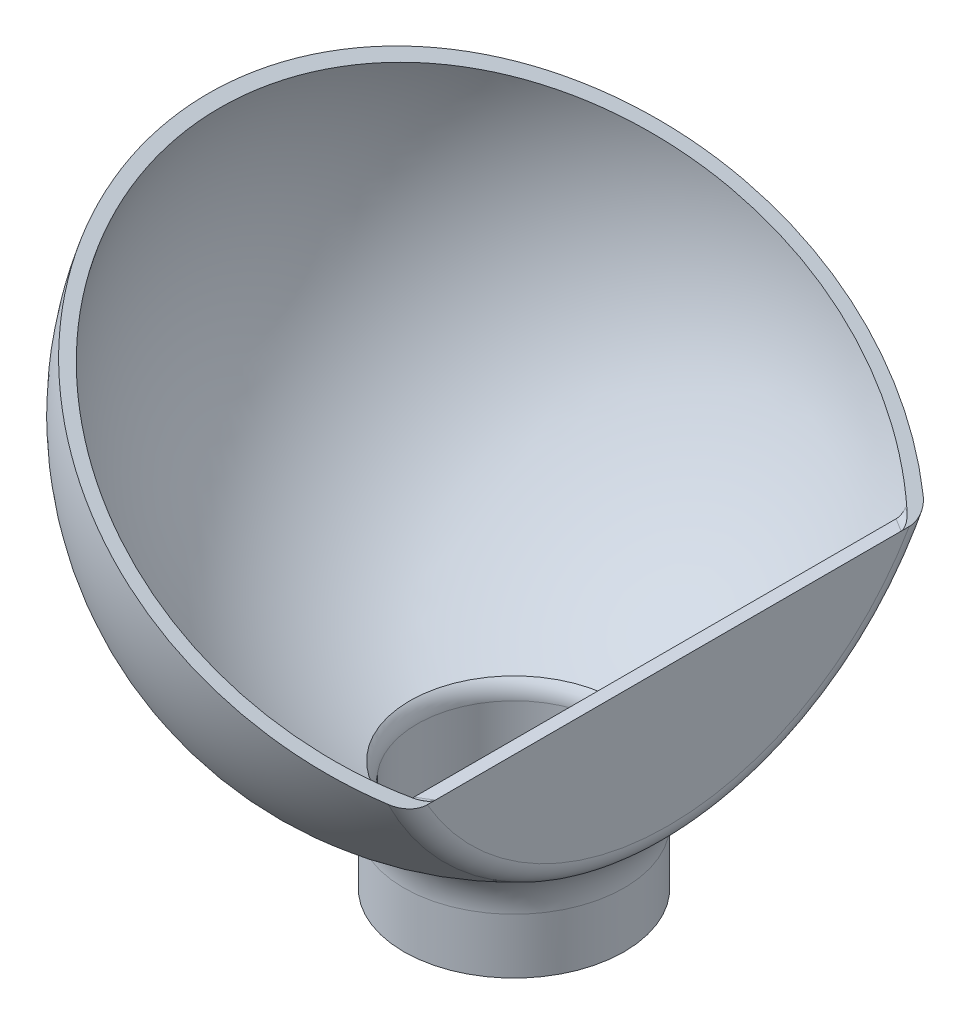
ISO-10303-21;
HEADER;
FILE_DESCRIPTION(('STEP AP214'),'2;1');
FILE_NAME('part.step','',(''),(''),'','','');
FILE_SCHEMA(('AUTOMOTIVE_DESIGN { 1 0 10303 214 1 1 1 1 }'));
ENDSEC;
DATA;
#1=APPLICATION_CONTEXT('core data for automotive mechanical design processes');
#2=APPLICATION_PROTOCOL_DEFINITION('international standard','automotive_design',2000,#1);
#3=PRODUCT_CONTEXT('',#1,'mechanical');
#4=PRODUCT('Part','Part','',(#3));
#5=PRODUCT_RELATED_PRODUCT_CATEGORY('part','',(#4));
#6=PRODUCT_DEFINITION_FORMATION('','',#4);
#7=PRODUCT_DEFINITION_CONTEXT('part definition',#1,'design');
#8=PRODUCT_DEFINITION('design','',#6,#7);
#9=PRODUCT_DEFINITION_SHAPE('','',#8);
#10=(LENGTH_UNIT() NAMED_UNIT(*) SI_UNIT(.MILLI.,.METRE.));
#11=(NAMED_UNIT(*) PLANE_ANGLE_UNIT() SI_UNIT($,.RADIAN.));
#12=(NAMED_UNIT(*) SI_UNIT($,.STERADIAN.) SOLID_ANGLE_UNIT());
#13=UNCERTAINTY_MEASURE_WITH_UNIT(LENGTH_MEASURE(1.E-05),#10,'distance_accuracy_value','');
#14=(GEOMETRIC_REPRESENTATION_CONTEXT(3) GLOBAL_UNCERTAINTY_ASSIGNED_CONTEXT((#13)) GLOBAL_UNIT_ASSIGNED_CONTEXT((#10,
#11,#12)) REPRESENTATION_CONTEXT('',''));
#15=CARTESIAN_POINT('',(0.,0.,0.));
#16=DIRECTION('',(0.,0.,1.));
#17=DIRECTION('',(1.,0.,0.));
#18=AXIS2_PLACEMENT_3D('',#15,#16,#17);
#19=CARTESIAN_POINT('',(0.,0.,0.));
#20=DIRECTION('',(-1.,0.,0.));
#21=DIRECTION('',(0.,0.,1.));
#22=AXIS2_PLACEMENT_3D('',#19,#20,#21);
#23=SPHERICAL_SURFACE('',#22,72.);
#24=CARTESIAN_POINT('',(32.,0.,0.));
#25=DIRECTION('',(1.,0.,0.));
#26=DIRECTION('',(0.,0.,-1.));
#27=AXIS2_PLACEMENT_3D('',#24,#25,#26);
#28=CIRCLE('',#27,64.4980619863884);
#29=CARTESIAN_POINT('',(32.,-30.6043866570128,56.7747436572642));
#30=VERTEX_POINT('',#29);
#31=CARTESIAN_POINT('',(32.,-30.6043866570128,-56.7747436572642));
#32=VERTEX_POINT('',#31);
#33=EDGE_CURVE('E126',#30,#32,#28,.T.);
#34=ORIENTED_EDGE('',*,*,#33,.T.);
#35=CARTESIAN_POINT('',(0.,-30.6043866570128,0.));
#36=DIRECTION('',(0.,1.,0.));
#37=DIRECTION('',(0.,0.,1.));
#38=AXIS2_PLACEMENT_3D('',#35,#36,#37);
#39=CIRCLE('',#38,65.1718613923836);
#40=CARTESIAN_POINT('',(33.0083526244297,-30.6043866570128,-56.1944852665221));
#41=VERTEX_POINT('',#40);
#42=EDGE_CURVE('E238',#32,#41,#39,.F.);
#43=ORIENTED_EDGE('',*,*,#42,.T.);
#44=CARTESIAN_POINT('',(-4.99999999999994,-8.6602540378444,0.));
#45=DIRECTION('',(0.499999999999995,0.866025403784442,0.));
#46=DIRECTION('',(-0.866025403784442,0.499999999999995,0.));
#47=AXIS2_PLACEMENT_3D('',#44,#45,#46);
#48=CIRCLE('',#47,71.3021738799035);
#49=CARTESIAN_POINT('',(33.0083526244297,-30.6043866570128,56.1944852665221));
#50=VERTEX_POINT('',#49);
#51=EDGE_CURVE('E117',#41,#50,#48,.T.);
#52=ORIENTED_EDGE('',*,*,#51,.T.);
#53=CARTESIAN_POINT('',(0.,-30.6043866570128,0.));
#54=DIRECTION('',(0.,1.,0.));
#55=DIRECTION('',(0.,0.,1.));
#56=AXIS2_PLACEMENT_3D('',#53,#54,#55);
#57=CIRCLE('',#56,65.1718613923836);
#58=EDGE_CURVE('E235',#50,#30,#57,.F.);
#59=ORIENTED_EDGE('',*,*,#58,.T.);
#60=EDGE_LOOP('',(#34,#43,#52,#59));
#61=FACE_BOUND('',#60,.T.);
#62=CARTESIAN_POINT('',(0.,-68.,0.));
#63=DIRECTION('',(0.,-1.,0.));
#64=DIRECTION('',(0.,0.,-1.));
#65=AXIS2_PLACEMENT_3D('',#62,#63,#64);
#66=CIRCLE('',#65,23.6643191323984);
#67=CARTESIAN_POINT('',(0.,-68.,-23.6643191323984));
#68=VERTEX_POINT('',#67);
#69=EDGE_CURVE('E265',#68,#68,#66,.T.);
#70=ORIENTED_EDGE('',*,*,#69,.T.);
#71=EDGE_LOOP('',(#70));
#72=FACE_BOUND('',#71,.T.);
#73=ADVANCED_FACE('F51',(#61,#72),#23,.F.);
#74=CARTESIAN_POINT('',(0.,0.,0.));
#75=DIRECTION('',(-1.,0.,0.));
#76=DIRECTION('',(0.,0.,-1.));
#77=AXIS2_PLACEMENT_3D('',#74,#75,#76);
#78=SPHERICAL_SURFACE('',#77,75.);
#79=CARTESIAN_POINT('',(0.,-68.,0.));
#80=DIRECTION('',(0.,-1.,0.));
#81=DIRECTION('',(0.,0.,-1.));
#82=AXIS2_PLACEMENT_3D('',#79,#80,#81);
#83=CIRCLE('',#82,31.6385840391127);
#84=CARTESIAN_POINT('',(0.,-68.,-31.6385840391127));
#85=VERTEX_POINT('',#84);
#86=EDGE_CURVE('E251',#85,#85,#83,.T.);
#87=ORIENTED_EDGE('',*,*,#86,.F.);
#88=EDGE_LOOP('',(#87));
#89=FACE_BOUND('',#88,.T.);
#90=CARTESIAN_POINT('',(-4.99999999999994,-8.6602540378444,0.));
#91=DIRECTION('',(0.499999999999995,0.866025403784442,0.));
#92=DIRECTION('',(-0.866025403784442,0.499999999999995,0.));
#93=AXIS2_PLACEMENT_3D('',#90,#91,#92);
#94=CIRCLE('',#93,74.3303437365925);
#95=CARTESIAN_POINT('',(32.1428571428572,-30.1046926077445,-60.7086832149001));
#96=VERTEX_POINT('',#95);
#97=CARTESIAN_POINT('',(32.1428571428572,-30.1046926077445,60.7086832149001));
#98=VERTEX_POINT('',#97);
#99=EDGE_CURVE('E104',#96,#98,#94,.T.);
#100=ORIENTED_EDGE('',*,*,#99,.F.);
#101=CARTESIAN_POINT('',(32.1428571428571,0.,0.));
#102=DIRECTION('',(-1.,0.,0.));
#103=DIRECTION('',(0.,0.,1.));
#104=AXIS2_PLACEMENT_3D('',#101,#102,#103);
#105=CIRCLE('',#104,67.7630927178938);
#106=EDGE_CURVE('E111',#96,#98,#105,.T.);
#107=ORIENTED_EDGE('',*,*,#106,.T.);
#108=EDGE_LOOP('',(#100,#107));
#109=FACE_BOUND('',#108,.T.);
#110=ADVANCED_FACE('F115',(#89,#109),#78,.T.);
#111=CARTESIAN_POINT('',(35.,0.,0.));
#112=DIRECTION('',(-1.,0.,0.));
#113=DIRECTION('',(0.,0.,1.));
#114=AXIS2_PLACEMENT_3D('',#111,#112,#113);
#115=PLANE('',#114);
#116=DIRECTION('',(0.,0.,-1.));
#117=VECTOR('',#116,1.);
#118=CARTESIAN_POINT('',(35.,-31.7542648054291,0.));
#119=LINE('',#118,#117);
#120=CARTESIAN_POINT('',(35.,-31.7542648054291,54.6961302714066));
#121=VERTEX_POINT('',#120);
#122=CARTESIAN_POINT('',(35.,-31.7542648054291,52.8174566397172));
#123=VERTEX_POINT('',#122);
#124=EDGE_CURVE('E218',#121,#123,#119,.T.);
#125=ORIENTED_EDGE('',*,*,#124,.F.);
#126=CARTESIAN_POINT('',(35.,0.,0.));
#127=DIRECTION('',(-1.,0.,0.));
#128=DIRECTION('',(0.,0.,1.));
#129=AXIS2_PLACEMENT_3D('',#126,#127,#128);
#130=CIRCLE('',#129,63.2455532033676);
#131=CARTESIAN_POINT('',(35.,-31.7542648054291,-54.6961302714066));
#132=VERTEX_POINT('',#131);
#133=EDGE_CURVE('E219',#121,#132,#130,.F.);
#134=ORIENTED_EDGE('',*,*,#133,.T.);
#135=CARTESIAN_POINT('',(35.,-31.7542648054291,-52.8174566397172));
#136=VERTEX_POINT('',#135);
#137=EDGE_CURVE('E68',#136,#132,#119,.T.);
#138=ORIENTED_EDGE('',*,*,#137,.F.);
#139=DIRECTION('',(0.,0.,1.));
#140=VECTOR('',#139,1.);
#141=CARTESIAN_POINT('',(35.,-31.7542648054291,58.2380173655207));
#142=LINE('',#141,#140);
#143=EDGE_CURVE('E220',#136,#123,#142,.T.);
#144=ORIENTED_EDGE('',*,*,#143,.T.);
#145=EDGE_LOOP('',(#125,#134,#138,#144));
#146=FACE_BOUND('',#145,.T.);
#147=ADVANCED_FACE('F209',(#146),#115,.F.);
#148=CARTESIAN_POINT('',(-4.99999999999994,-8.6602540378444,0.));
#149=DIRECTION('',(0.499999999999995,0.866025403784442,0.));
#150=DIRECTION('',(-0.866025403784442,0.499999999999995,0.));
#151=AXIS2_PLACEMENT_3D('',#148,#149,#150);
#152=PLANE('',#151);
#153=ORIENTED_EDGE('',*,*,#99,.T.);
#154=CARTESIAN_POINT('',(32.1428571428572,-30.1046926077445,60.7086832149001));
#155=CARTESIAN_POINT('',(32.2923343488514,-30.190993312863,60.5867321881159));
#156=CARTESIAN_POINT('',(32.4374815556439,-30.2747940917768,60.4577682343076));
#157=CARTESIAN_POINT('',(32.718395137539,-30.4369796239029,60.186925985363));
#158=CARTESIAN_POINT('',(32.8541633605718,-30.5153654440182,60.0450502470601));
#159=CARTESIAN_POINT('',(33.1164090754071,-30.6667730780723,59.7485975753028));
#160=CARTESIAN_POINT('',(33.2428286966424,-30.7397614804233,59.5939523415222));
#161=CARTESIAN_POINT('',(33.4847779677565,-30.8794509572312,59.2737330141498));
#162=CARTESIAN_POINT('',(33.6003065915381,-30.9461514392707,59.1081578932905));
#163=CARTESIAN_POINT('',(33.9435319602747,-31.1443126983035,58.5746308145358));
#164=CARTESIAN_POINT('',(34.1509487445831,-31.2640648345583,58.1888525768666));
#165=CARTESIAN_POINT('',(34.504422222787,-31.4681428423508,57.3827834111008));
#166=CARTESIAN_POINT('',(34.6507061733792,-31.5525999206033,56.9626273763576));
#167=CARTESIAN_POINT('',(34.7995758235354,-31.6385498531951,56.3822987151888));
#168=CARTESIAN_POINT('',(34.8334790142155,-31.6581238694607,56.2323690010885));
#169=CARTESIAN_POINT('',(34.8923818591121,-31.6921314428178,55.9302161760452));
#170=CARTESIAN_POINT('',(34.917385180237,-31.7065671169999,55.7779940366313));
#171=CARTESIAN_POINT('',(34.9579952093097,-31.7300133282168,55.4713736510387));
#172=CARTESIAN_POINT('',(34.9735714177261,-31.739006256339,55.3169699781996));
#173=CARTESIAN_POINT('',(34.99457416574,-31.7511321985585,55.007108944637));
#174=CARTESIAN_POINT('',(34.9999912540346,-31.7542597559436,54.85165073763));
#175=CARTESIAN_POINT('',(35.,-31.7542648054291,54.6961302714066));
#176=B_SPLINE_CURVE_WITH_KNOTS('',3,(#154,#155,#156,#157,#158,#159,#160,#161,#162,#163,#164,
#165,#166,#167,#168,#169,#170,#171,#172,#173,#174,#175),.UNSPECIFIED.,.F.,.F.,(4,2,2,2,2,2,2,2,
2,2,4),(0.,0.633779324363759,1.26743341765179,1.90472868776747,2.5420839408753,3.89755440133052,
5.24794018946461,5.71254819698764,6.17696455535823,6.64287551770667,7.1092197149496),.UNSPECIFIED.);
#177=EDGE_CURVE('E110',#98,#121,#176,.T.);
#178=ORIENTED_EDGE('',*,*,#177,.T.);
#179=ORIENTED_EDGE('',*,*,#124,.T.);
#180=CARTESIAN_POINT('',(35.,-31.7542648054291,52.8174566397172));
#181=CARTESIAN_POINT('',(34.999923850626,-31.7542208405675,52.8848111848367));
#182=CARTESIAN_POINT('',(34.9959130784819,-31.7519052201905,52.9519582406057));
#183=CARTESIAN_POINT('',(34.9814721948271,-31.743567772125,53.08506099842));
#184=CARTESIAN_POINT('',(34.9710698209088,-31.7375619587431,53.1510205874645));
#185=CARTESIAN_POINT('',(34.9454695763324,-31.7227816506456,53.2805535728165));
#186=CARTESIAN_POINT('',(34.9303481954055,-31.7140513172969,53.3441480853675));
#187=CARTESIAN_POINT('',(34.8961345377893,-31.6942980528623,53.4699746381853));
#188=CARTESIAN_POINT('',(34.8770368496442,-31.6832719974707,53.5322046926179));
#189=CARTESIAN_POINT('',(34.8201701101709,-31.6504399701279,53.7009243029066));
#190=CARTESIAN_POINT('',(34.779076338011,-31.6267144697094,53.805918601958));
#191=CARTESIAN_POINT('',(34.6894827754461,-31.5749876022449,54.0115445651203));
#192=CARTESIAN_POINT('',(34.6409807282724,-31.5469849322529,54.1121748878075));
#193=CARTESIAN_POINT('',(34.5372874403922,-31.4871175845821,54.3109194728345));
#194=CARTESIAN_POINT('',(34.4820011288755,-31.4551980177454,54.4089672016901));
#195=CARTESIAN_POINT('',(34.3664612417104,-31.3884910327885,54.6010918049347));
#196=CARTESIAN_POINT('',(34.306206129349,-31.3537027274466,54.6951674371597));
#197=CARTESIAN_POINT('',(34.1529292820711,-31.2652082984102,54.9217928063309));
#198=CARTESIAN_POINT('',(34.0575465310433,-31.2101390414282,55.0522156626545));
#199=CARTESIAN_POINT('',(33.8594640920118,-31.0957760919317,55.3054984771439));
#200=CARTESIAN_POINT('',(33.7567604009829,-31.0364800882694,55.428354228181));
#201=CARTESIAN_POINT('',(33.5491105867197,-30.9165934121074,55.6622196727387));
#202=CARTESIAN_POINT('',(33.444392972652,-30.8561346694365,55.7735008251062));
#203=CARTESIAN_POINT('',(33.2299773422114,-30.7323417474831,55.9891306947901));
#204=CARTESIAN_POINT('',(33.1202862117617,-30.6690115437903,56.093488532205));
#205=CARTESIAN_POINT('',(33.0083526244297,-30.6043866570128,56.1944852665221));
#206=B_SPLINE_CURVE_WITH_KNOTS('',3,(#180,#181,#182,#183,#184,#185,#186,#187,#188,#189,#190,
#191,#192,#193,#194,#195,#196,#197,#198,#199,#200,#201,#202,#203,#204,#205),.UNSPECIFIED.,.F.,
.F.,(4,2,2,2,2,2,2,2,2,2,2,2,4),(0.,0.201621060552022,0.402373267565353,0.60002713948422,
0.79795178262911,1.14304120483985,1.48823596141764,1.838984786464,2.18984249822409,
2.70149845685975,3.21343636284988,3.70617706614148,4.19825523495729),.UNSPECIFIED.);
#207=EDGE_CURVE('E174',#123,#50,#206,.T.);
#208=ORIENTED_EDGE('',*,*,#207,.T.);
#209=ORIENTED_EDGE('',*,*,#51,.F.);
#210=CARTESIAN_POINT('',(33.0083526244297,-30.6043866570128,-56.194485266522));
#211=CARTESIAN_POINT('',(33.0843273463035,-30.6482506831382,-56.1259589035505));
#212=CARTESIAN_POINT('',(33.1592526423887,-30.6915088230021,-56.0558736075829));
#213=CARTESIAN_POINT('',(33.3068485422009,-30.77672335549,-55.912572536207));
#214=CARTESIAN_POINT('',(33.3795186825846,-30.8186794806025,-55.8393561247338));
#215=CARTESIAN_POINT('',(33.5229054092312,-30.9014638458302,-55.6892973372365));
#216=CARTESIAN_POINT('',(33.5936052571502,-30.9422824220579,-55.6124336063606));
#217=CARTESIAN_POINT('',(33.7322959934059,-31.0223555559692,-55.4555199700178));
#218=CARTESIAN_POINT('',(33.8002870478542,-31.0616102095575,-55.3754702605288));
#219=CARTESIAN_POINT('',(33.9376066343372,-31.1408917097784,-55.206800809683));
#220=CARTESIAN_POINT('',(34.0067342618369,-31.1808025641238,-55.1179623682471));
#221=CARTESIAN_POINT('',(34.1411372236,-31.2584001502776,-54.936483869853));
#222=CARTESIAN_POINT('',(34.2064129192318,-31.2960870907222,-54.8438441708963));
#223=CARTESIAN_POINT('',(34.3323307704816,-31.368785796037,-54.6548479575919));
#224=CARTESIAN_POINT('',(34.392985133379,-31.4038046087834,-54.5585023242466));
#225=CARTESIAN_POINT('',(34.5089902438428,-31.470780190537,-54.3616742853697));
#226=CARTESIAN_POINT('',(34.5643436566968,-31.5027384983488,-54.2611939954417));
#227=CARTESIAN_POINT('',(34.6499586601975,-31.5521683436666,-54.0924034817462));
#228=CARTESIAN_POINT('',(34.6821337603201,-31.5707446463836,-54.0253859285582));
#229=CARTESIAN_POINT('',(34.7433165367139,-31.6060685388044,-53.8894223893855));
#230=CARTESIAN_POINT('',(34.772323684404,-31.6228158233316,-53.820476083987));
#231=CARTESIAN_POINT('',(34.8261669153423,-31.6539022272079,-53.6815743873664));
#232=CARTESIAN_POINT('',(34.8510553688123,-31.6682715825185,-53.6116463408547));
#233=CARTESIAN_POINT('',(34.8963120867893,-31.6944005608252,-53.4698821022416));
#234=CARTESIAN_POINT('',(34.9166819670381,-31.7061611166702,-53.3980466025247));
#235=CARTESIAN_POINT('',(34.9540654402654,-31.7277444750012,-53.243048820769));
#236=CARTESIAN_POINT('',(34.9703033379526,-31.737119429602,-53.1596239545725));
#237=CARTESIAN_POINT('',(34.9875241161928,-31.7470618505546,-53.0327206152755));
#238=CARTESIAN_POINT('',(34.9920799562375,-31.7496921660308,-52.9898879878193));
#239=CARTESIAN_POINT('',(34.9983147800296,-31.7532918432255,-52.9038730112755));
#240=CARTESIAN_POINT('',(34.9999885693482,-31.7542582059392,-52.860690171377));
#241=CARTESIAN_POINT('',(35.,-31.7542648054291,-52.8174566397172));
#242=B_SPLINE_CURVE_WITH_KNOTS('',3,(#210,#211,#212,#213,#214,#215,#216,#217,#218,#219,#220,
#221,#222,#223,#224,#225,#226,#227,#228,#229,#230,#231,#232,#233,#234,#235,#236,#237,#238,#239,
#240,#241),.UNSPECIFIED.,.F.,.F.,(4,2,2,2,2,2,2,2,2,2,2,2,2,2,2,4),(0.,0.333948357788062,
0.667964880212886,1.00426336887587,1.34054120281373,1.69870300570306,2.05683115409285,
2.41397791044057,2.77094414210297,3.00073305133774,3.23056024307073,3.45719304880076,
3.68374468455962,3.93962027033629,4.06896878397422,4.19855018424465),.UNSPECIFIED.);
#243=EDGE_CURVE('E167',#41,#136,#242,.T.);
#244=ORIENTED_EDGE('',*,*,#243,.T.);
#245=ORIENTED_EDGE('',*,*,#137,.T.);
#246=CARTESIAN_POINT('',(35.,-31.7542648054291,-54.6961302714066));
#247=CARTESIAN_POINT('',(34.9999669509836,-31.7542457245706,-54.9110690655741));
#248=CARTESIAN_POINT('',(34.989639759257,-31.7482833176472,-55.1258079549404));
#249=CARTESIAN_POINT('',(34.9500469290783,-31.7254243864856,-55.5526566345392));
#250=CARTESIAN_POINT('',(34.9208089422199,-31.7085438269023,-55.7647698033496));
#251=CARTESIAN_POINT('',(34.8452824324468,-31.6649385761539,-56.183403347645));
#252=CARTESIAN_POINT('',(34.799106613605,-31.6382789547155,-56.3899512183633));
#253=CARTESIAN_POINT('',(34.6910283552463,-31.5758799431586,-56.7974908664415));
#254=CARTESIAN_POINT('',(34.6291209778537,-31.5401377021561,-56.9984808772767));
#255=CARTESIAN_POINT('',(34.4389742914809,-31.4303564615933,-57.5415170195668));
#256=CARTESIAN_POINT('',(34.2957422590817,-31.347661409131,-57.8767026674965));
#257=CARTESIAN_POINT('',(33.9699045977438,-31.1595389476455,-58.5209711920177));
#258=CARTESIAN_POINT('',(33.7872280216678,-31.0540705772733,-58.8300056189112));
#259=CARTESIAN_POINT('',(33.3803738698748,-30.8191732232147,-59.4257496313975));
#260=CARTESIAN_POINT('',(33.1550556328552,-30.6890856784182,-59.7114288084158));
#261=CARTESIAN_POINT('',(32.7928324487244,-30.4799560255536,-60.109415566856));
#262=CARTESIAN_POINT('',(32.6681813276488,-30.4079886672457,-60.2368816687488));
#263=CARTESIAN_POINT('',(32.4111793689419,-30.2596085172041,-60.4810469741947));
#264=CARTESIAN_POINT('',(32.278827423093,-30.1831950856405,-60.5977446217909));
#265=CARTESIAN_POINT('',(32.1428571428571,-30.1046926077445,-60.7086832149001));
#266=B_SPLINE_CURVE_WITH_KNOTS('',3,(#246,#247,#248,#249,#250,#251,#252,#253,#254,#255,#256,
#257,#258,#259,#260,#261,#262,#263,#264,#265),.UNSPECIFIED.,.F.,.F.,(4,2,2,2,2,2,2,2,2,4),(0.,
0.644200552656595,1.28746127048281,1.92651716604468,2.5657738989725,3.68285703093653,
4.80196640081981,5.95687563813245,6.53322763790303,7.10966278602524),.UNSPECIFIED.);
#267=EDGE_CURVE('E101',#132,#96,#266,.T.);
#268=ORIENTED_EDGE('',*,*,#267,.T.);
#269=EDGE_LOOP('',(#153,#178,#179,#208,#209,#244,#245,#268));
#270=FACE_BOUND('',#269,.T.);
#271=ADVANCED_FACE('F103',(#270),#152,.T.);
#272=CARTESIAN_POINT('',(32.,0.,0.));
#273=DIRECTION('',(1.,0.,0.));
#274=DIRECTION('',(0.,0.,-1.));
#275=AXIS2_PLACEMENT_3D('',#272,#273,#274);
#276=PLANE('',#275);
#277=ORIENTED_EDGE('',*,*,#33,.F.);
#278=CARTESIAN_POINT('',(32.0000000000001,-30.6043866570128,56.7747436572641));
#279=CARTESIAN_POINT('',(32.,-30.6560642364063,56.7468890259305));
#280=CARTESIAN_POINT('',(32.,-30.7064051169053,56.7166444755982));
#281=CARTESIAN_POINT('',(32.,-30.8041244170545,56.6517691224038));
#282=CARTESIAN_POINT('',(32.,-30.8515050568931,56.6171416671765));
#283=CARTESIAN_POINT('',(32.,-30.9883148803341,56.5076642256299));
#284=CARTESIAN_POINT('',(32.,-31.0730648578337,56.4268609127201));
#285=CARTESIAN_POINT('',(32.,-31.2281033563033,56.2529824061796));
#286=CARTESIAN_POINT('',(32.,-31.2984318231743,56.1599423149121));
#287=CARTESIAN_POINT('',(32.,-31.4243599836311,55.9642052128606));
#288=CARTESIAN_POINT('',(32.,-31.4799342944575,55.8614919664738));
#289=CARTESIAN_POINT('',(32.,-31.5809667550683,55.637945002926));
#290=CARTESIAN_POINT('',(32.,-31.6247254985982,55.5163450472663));
#291=CARTESIAN_POINT('',(32.,-31.6935048643182,55.2681064696616));
#292=CARTESIAN_POINT('',(32.,-31.7185396136208,55.1414717225599));
#293=CARTESIAN_POINT('',(32.,-31.747615609023,54.9053740363403));
#294=CARTESIAN_POINT('',(32.,-31.7542706807828,54.7962286906602));
#295=CARTESIAN_POINT('',(32.,-31.7542648054291,54.6871440641071));
#296=B_SPLINE_CURVE_WITH_KNOTS('',3,(#278,#279,#280,#281,#282,#283,#284,#285,#286,#287,#288,
#289,#290,#291,#292,#293,#294,#295),.UNSPECIFIED.,.F.,.F.,(4,2,2,2,2,2,2,2,4),(0.,
0.175979990177831,0.351826370015744,0.70131632676307,1.04982475645108,1.39892892391519,
1.78508053033409,2.17094049355153,2.4981146757966),.UNSPECIFIED.);
#297=CARTESIAN_POINT('',(32.,-31.7542648054291,54.6871440641071));
#298=VERTEX_POINT('',#297);
#299=EDGE_CURVE('E61',#30,#298,#296,.T.);
#300=ORIENTED_EDGE('',*,*,#299,.T.);
#301=DIRECTION('',(0.,0.,1.));
#302=VECTOR('',#301,1.);
#303=CARTESIAN_POINT('',(32.,-31.7542648054291,58.2380173655207));
#304=LINE('',#303,#302);
#305=CARTESIAN_POINT('',(32.,-31.7542648054291,-54.6871440641071));
#306=VERTEX_POINT('',#305);
#307=EDGE_CURVE('E118',#306,#298,#304,.T.);
#308=ORIENTED_EDGE('',*,*,#307,.F.);
#309=CARTESIAN_POINT('',(32.,-31.7542648054291,-54.6871440641071));
#310=CARTESIAN_POINT('',(32.,-31.7542497200021,-54.772277176809));
#311=CARTESIAN_POINT('',(32.,-31.7502117017188,-54.8573519358246));
#312=CARTESIAN_POINT('',(32.,-31.734009328717,-55.0267918263233));
#313=CARTESIAN_POINT('',(32.,-31.7218383568046,-55.1111563232737));
#314=CARTESIAN_POINT('',(32.,-31.6728015774757,-55.3631810621219));
#315=CARTESIAN_POINT('',(32.,-31.623409371987,-55.5286382277935));
#316=CARTESIAN_POINT('',(32.,-31.5008181640113,-55.823427406445));
#317=CARTESIAN_POINT('',(32.,-31.4319277238631,-55.9545719347382));
#318=CARTESIAN_POINT('',(32.,-31.2706611278839,-56.200704639207));
#319=CARTESIAN_POINT('',(32.,-31.1784333908949,-56.3157880386335));
#320=CARTESIAN_POINT('',(32.,-31.0061894814503,-56.4900141793313));
#321=CARTESIAN_POINT('',(32.,-30.9321378940338,-56.5551049131179));
#322=CARTESIAN_POINT('',(32.,-30.7748516546953,-56.6740239009611));
#323=CARTESIAN_POINT('',(32.,-30.6915676552935,-56.7277866926558));
#324=CARTESIAN_POINT('',(32.,-30.6043866570128,-56.7747436572642));
#325=B_SPLINE_CURVE_WITH_KNOTS('',3,(#309,#310,#311,#312,#313,#314,#315,#316,#317,#318,#319,
#320,#321,#322,#323,#324),.UNSPECIFIED.,.F.,.F.,(4,2,2,2,2,2,2,4),(0.,0.25518278369667,
0.510573444308676,1.02470233806688,1.46675043965989,1.9060549507572,2.20083401185156,
2.4972724683681),.UNSPECIFIED.);
#326=EDGE_CURVE('E159',#306,#32,#325,.T.);
#327=ORIENTED_EDGE('',*,*,#326,.T.);
#328=EDGE_LOOP('',(#277,#300,#308,#327));
#329=FACE_BOUND('',#328,.T.);
#330=ADVANCED_FACE('F185',(#329),#276,.F.);
#331=CARTESIAN_POINT('',(32.,-31.7542648054291,58.2380173655207));
#332=DIRECTION('',(0.,1.,0.));
#333=DIRECTION('',(0.,0.,1.));
#334=AXIS2_PLACEMENT_3D('',#331,#332,#333);
#335=PLANE('',#334);
#336=ORIENTED_EDGE('',*,*,#143,.F.);
#337=CARTESIAN_POINT('',(0.,-31.7542648054291,0.));
#338=DIRECTION('',(0.,1.,0.));
#339=DIRECTION('',(0.,0.,1.));
#340=AXIS2_PLACEMENT_3D('',#337,#338,#339);
#341=CIRCLE('',#340,63.3615319092618);
#342=EDGE_CURVE('E229',#136,#306,#341,.T.);
#343=ORIENTED_EDGE('',*,*,#342,.T.);
#344=ORIENTED_EDGE('',*,*,#307,.T.);
#345=CARTESIAN_POINT('',(0.,-31.7542648054291,0.));
#346=DIRECTION('',(0.,1.,0.));
#347=DIRECTION('',(0.,0.,1.));
#348=AXIS2_PLACEMENT_3D('',#345,#346,#347);
#349=CIRCLE('',#348,63.3615319092618);
#350=EDGE_CURVE('E225',#298,#123,#349,.T.);
#351=ORIENTED_EDGE('',*,*,#350,.T.);
#352=EDGE_LOOP('',(#336,#343,#344,#351));
#353=FACE_BOUND('',#352,.T.);
#354=ADVANCED_FACE('F189',(#353),#335,.T.);
#355=CARTESIAN_POINT('',(0.,-93.,0.));
#356=DIRECTION('',(0.,-1.,0.));
#357=DIRECTION('',(0.,0.,-1.));
#358=AXIS2_PLACEMENT_3D('',#355,#356,#357);
#359=PLANE('',#358);
#360=CARTESIAN_POINT('',(0.,-93.,0.));
#361=DIRECTION('',(0.,1.,0.));
#362=DIRECTION('',(0.,0.,1.));
#363=AXIS2_PLACEMENT_3D('',#360,#361,#362);
#364=CIRCLE('',#363,22.);
#365=CARTESIAN_POINT('',(0.,-93.,22.));
#366=VERTEX_POINT('',#365);
#367=EDGE_CURVE('E274',#366,#366,#364,.T.);
#368=ORIENTED_EDGE('',*,*,#367,.T.);
#369=EDGE_LOOP('',(#368));
#370=FACE_BOUND('',#369,.T.);
#371=CARTESIAN_POINT('',(0.,-93.,0.));
#372=DIRECTION('',(0.,-1.,0.));
#373=DIRECTION('',(0.,0.,-1.));
#374=AXIS2_PLACEMENT_3D('',#371,#372,#373);
#375=CIRCLE('',#374,25.);
#376=CARTESIAN_POINT('',(0.,-93.,-25.));
#377=VERTEX_POINT('',#376);
#378=EDGE_CURVE('E270',#377,#377,#375,.T.);
#379=ORIENTED_EDGE('',*,*,#378,.T.);
#380=EDGE_LOOP('',(#379));
#381=FACE_BOUND('',#380,.T.);
#382=ADVANCED_FACE('F195',(#370,#381),#359,.T.);
#383=CARTESIAN_POINT('',(0.,-93.,0.));
#384=DIRECTION('',(0.,1.,0.));
#385=DIRECTION('',(0.,0.,1.));
#386=AXIS2_PLACEMENT_3D('',#383,#384,#385);
#387=CYLINDRICAL_SURFACE('',#386,25.);
#388=CARTESIAN_POINT('',(0.,-80.4533819956275,0.));
#389=DIRECTION('',(0.,1.,0.));
#390=DIRECTION('',(0.,0.,1.));
#391=AXIS2_PLACEMENT_3D('',#388,#389,#390);
#392=CIRCLE('',#391,25.);
#393=CARTESIAN_POINT('',(0.,-80.4533819956275,25.));
#394=VERTEX_POINT('',#393);
#395=EDGE_CURVE('E122',#394,#394,#392,.F.);
#396=ORIENTED_EDGE('',*,*,#395,.T.);
#397=EDGE_LOOP('',(#396));
#398=FACE_BOUND('',#397,.T.);
#399=ORIENTED_EDGE('',*,*,#378,.F.);
#400=EDGE_LOOP('',(#399));
#401=FACE_BOUND('',#400,.T.);
#402=ADVANCED_FACE('F191',(#398,#401),#387,.T.);
#403=CARTESIAN_POINT('',(0.,-93.,0.));
#404=DIRECTION('',(0.,1.,0.));
#405=DIRECTION('',(0.,0.,1.));
#406=AXIS2_PLACEMENT_3D('',#403,#404,#405);
#407=CYLINDRICAL_SURFACE('',#406,22.);
#408=CARTESIAN_POINT('',(0.,-71.7246789324071,0.));
#409=DIRECTION('',(0.,1.,0.));
#410=DIRECTION('',(0.,0.,1.));
#411=AXIS2_PLACEMENT_3D('',#408,#409,#410);
#412=CIRCLE('',#411,22.);
#413=CARTESIAN_POINT('',(0.,-71.7246789324071,22.));
#414=VERTEX_POINT('',#413);
#415=EDGE_CURVE('E13',#414,#414,#412,.T.);
#416=ORIENTED_EDGE('',*,*,#415,.T.);
#417=EDGE_LOOP('',(#416));
#418=FACE_BOUND('',#417,.T.);
#419=ORIENTED_EDGE('',*,*,#367,.F.);
#420=EDGE_LOOP('',(#419));
#421=FACE_BOUND('',#420,.T.);
#422=ADVANCED_FACE('F280',(#418,#421),#407,.F.);
#423=CARTESIAN_POINT('',(0.,-80.4533819956275,0.));
#424=DIRECTION('',(0.,1.,0.));
#425=DIRECTION('',(0.,0.,1.));
#426=AXIS2_PLACEMENT_3D('',#423,#424,#425);
#427=TOROIDAL_SURFACE('',#426,40.,15.);
#428=ORIENTED_EDGE('',*,*,#86,.T.);
#429=EDGE_LOOP('',(#428));
#430=FACE_BOUND('',#429,.T.);
#431=ORIENTED_EDGE('',*,*,#395,.F.);
#432=EDGE_LOOP('',(#431));
#433=FACE_BOUND('',#432,.T.);
#434=ADVANCED_FACE('F149',(#430,#433),#427,.F.);
#435=CARTESIAN_POINT('',(30.,0.,0.));
#436=DIRECTION('',(-1.,0.,0.));
#437=DIRECTION('',(0.,0.,1.));
#438=AXIS2_PLACEMENT_3D('',#435,#436,#437);
#439=TOROIDAL_SURFACE('',#438,63.2455532033676,5.);
#440=ORIENTED_EDGE('',*,*,#267,.F.);
#441=ORIENTED_EDGE('',*,*,#133,.F.);
#442=ORIENTED_EDGE('',*,*,#177,.F.);
#443=ORIENTED_EDGE('',*,*,#106,.F.);
#444=EDGE_LOOP('',(#440,#441,#442,#443));
#445=FACE_BOUND('',#444,.T.);
#446=ADVANCED_FACE('F120',(#445),#439,.T.);
#447=CARTESIAN_POINT('',(0.,-29.7542648054291,0.));
#448=DIRECTION('',(0.,1.,0.));
#449=DIRECTION('',(0.,0.,1.));
#450=AXIS2_PLACEMENT_3D('',#447,#448,#449);
#451=TOROIDAL_SURFACE('',#450,63.3615319092618,2.);
#452=ORIENTED_EDGE('',*,*,#243,.F.);
#453=ORIENTED_EDGE('',*,*,#42,.F.);
#454=ORIENTED_EDGE('',*,*,#326,.F.);
#455=ORIENTED_EDGE('',*,*,#342,.F.);
#456=EDGE_LOOP('',(#452,#453,#454,#455));
#457=FACE_BOUND('',#456,.T.);
#458=ADVANCED_FACE('F148',(#457),#451,.F.);
#459=CARTESIAN_POINT('',(0.,-29.7542648054291,0.));
#460=DIRECTION('',(0.,1.,0.));
#461=DIRECTION('',(0.,0.,1.));
#462=AXIS2_PLACEMENT_3D('',#459,#460,#461);
#463=TOROIDAL_SURFACE('',#462,63.3615319092618,2.);
#464=ORIENTED_EDGE('',*,*,#299,.F.);
#465=ORIENTED_EDGE('',*,*,#58,.F.);
#466=ORIENTED_EDGE('',*,*,#207,.F.);
#467=ORIENTED_EDGE('',*,*,#350,.F.);
#468=EDGE_LOOP('',(#464,#465,#466,#467));
#469=FACE_BOUND('',#468,.T.);
#470=ADVANCED_FACE('F154',(#469),#463,.F.);
#471=CARTESIAN_POINT('',(0.,-71.7246789324071,0.));
#472=DIRECTION('',(0.,1.,0.));
#473=DIRECTION('',(0.,0.,1.));
#474=AXIS2_PLACEMENT_3D('',#471,#472,#473);
#475=TOROIDAL_SURFACE('',#474,27.,5.);
#476=ORIENTED_EDGE('',*,*,#69,.F.);
#477=EDGE_LOOP('',(#476));
#478=FACE_BOUND('',#477,.T.);
#479=ORIENTED_EDGE('',*,*,#415,.F.);
#480=EDGE_LOOP('',(#479));
#481=FACE_BOUND('',#480,.T.);
#482=ADVANCED_FACE('F53',(#478,#481),#475,.T.);
#483=CLOSED_SHELL('',(#73,#110,#147,#271,#330,#354,#382,#402,#422,#434,#446,#458,#470,#482));
#484=MANIFOLD_SOLID_BREP('B2',#483);
#485=ADVANCED_BREP_SHAPE_REPRESENTATION('',(#18,#484),#14);
#486=SHAPE_DEFINITION_REPRESENTATION(#9,#485);
ENDSEC;
END-ISO-10303-21;
